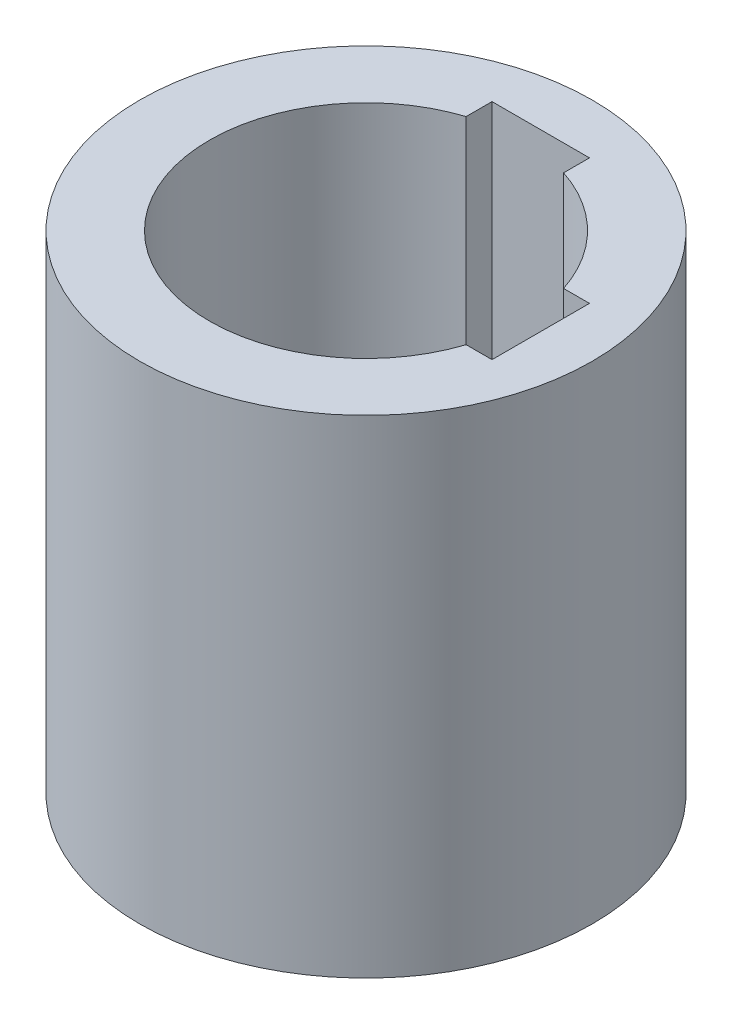
ISO-10303-21;
HEADER;
FILE_DESCRIPTION(('STEP AP214'),'2;1');
FILE_NAME('part.step','',(''),(''),'','','');
FILE_SCHEMA(('AUTOMOTIVE_DESIGN { 1 0 10303 214 1 1 1 1 }'));
ENDSEC;
DATA;
#1=APPLICATION_CONTEXT('core data for automotive mechanical design processes');
#2=APPLICATION_PROTOCOL_DEFINITION('international standard','automotive_design',2000,#1);
#3=PRODUCT_CONTEXT('',#1,'mechanical');
#4=PRODUCT('Part','Part','',(#3));
#5=PRODUCT_RELATED_PRODUCT_CATEGORY('part','',(#4));
#6=PRODUCT_DEFINITION_FORMATION('','',#4);
#7=PRODUCT_DEFINITION_CONTEXT('part definition',#1,'design');
#8=PRODUCT_DEFINITION('design','',#6,#7);
#9=PRODUCT_DEFINITION_SHAPE('','',#8);
#10=(LENGTH_UNIT() NAMED_UNIT(*) SI_UNIT(.MILLI.,.METRE.));
#11=(NAMED_UNIT(*) PLANE_ANGLE_UNIT() SI_UNIT($,.RADIAN.));
#12=(NAMED_UNIT(*) SI_UNIT($,.STERADIAN.) SOLID_ANGLE_UNIT());
#13=UNCERTAINTY_MEASURE_WITH_UNIT(LENGTH_MEASURE(1.E-05),#10,'distance_accuracy_value','');
#14=(GEOMETRIC_REPRESENTATION_CONTEXT(3) GLOBAL_UNCERTAINTY_ASSIGNED_CONTEXT((#13)) GLOBAL_UNIT_ASSIGNED_CONTEXT((#10,
#11,#12)) REPRESENTATION_CONTEXT('',''));
#15=CARTESIAN_POINT('',(0.,0.,0.));
#16=DIRECTION('',(0.,0.,1.));
#17=DIRECTION('',(1.,0.,0.));
#18=AXIS2_PLACEMENT_3D('',#15,#16,#17);
#19=CARTESIAN_POINT('',(0.,35.,0.));
#20=DIRECTION('',(0.,-1.,0.));
#21=DIRECTION('',(0.,0.,-1.));
#22=AXIS2_PLACEMENT_3D('',#19,#20,#21);
#23=CYLINDRICAL_SURFACE('',#22,22.5);
#24=DIRECTION('',(0.,-1.,0.));
#25=VECTOR('',#24,1.);
#26=CARTESIAN_POINT('',(-7.00000000000007,35.,-21.3834047803431));
#27=LINE('',#26,#25);
#28=CARTESIAN_POINT('',(-7.00000000000007,35.,-21.3834047803431));
#29=VERTEX_POINT('',#28);
#30=CARTESIAN_POINT('',(-7.00000000000007,-35.,-21.3834047803431));
#31=VERTEX_POINT('',#30);
#32=EDGE_CURVE('E11',#29,#31,#27,.T.);
#33=ORIENTED_EDGE('',*,*,#32,.F.);
#34=CARTESIAN_POINT('',(0.,35.,0.));
#35=DIRECTION('',(0.,1.,0.));
#36=DIRECTION('',(0.,0.,1.));
#37=AXIS2_PLACEMENT_3D('',#34,#35,#36);
#38=CIRCLE('',#37,22.5);
#39=CARTESIAN_POINT('',(21.3834047803431,35.,7.));
#40=VERTEX_POINT('',#39);
#41=EDGE_CURVE('E151',#29,#40,#38,.T.);
#42=ORIENTED_EDGE('',*,*,#41,.T.);
#43=DIRECTION('',(0.,-1.,0.));
#44=VECTOR('',#43,1.);
#45=CARTESIAN_POINT('',(21.3834047803431,35.,7.));
#46=LINE('',#45,#44);
#47=CARTESIAN_POINT('',(21.3834047803431,-35.,7.));
#48=VERTEX_POINT('',#47);
#49=EDGE_CURVE('E156',#48,#40,#46,.F.);
#50=ORIENTED_EDGE('',*,*,#49,.F.);
#51=CARTESIAN_POINT('',(0.,-35.,0.));
#52=DIRECTION('',(0.,1.,0.));
#53=DIRECTION('',(0.,0.,1.));
#54=AXIS2_PLACEMENT_3D('',#51,#52,#53);
#55=CIRCLE('',#54,22.5);
#56=EDGE_CURVE('E57',#31,#48,#55,.T.);
#57=ORIENTED_EDGE('',*,*,#56,.F.);
#58=EDGE_LOOP('',(#33,#42,#50,#57));
#59=FACE_BOUND('',#58,.T.);
#60=ADVANCED_FACE('F34',(#59),#23,.F.);
#61=CARTESIAN_POINT('',(0.,35.,0.));
#62=DIRECTION('',(0.,1.,0.));
#63=DIRECTION('',(0.,0.,1.));
#64=AXIS2_PLACEMENT_3D('',#61,#62,#63);
#65=PLANE('',#64);
#66=DIRECTION('',(0.,0.,1.));
#67=VECTOR('',#66,1.);
#68=CARTESIAN_POINT('',(-7.00000000000009,35.,-25.1));
#69=LINE('',#68,#67);
#70=CARTESIAN_POINT('',(-7.00000000000009,35.,-25.1));
#71=VERTEX_POINT('',#70);
#72=EDGE_CURVE('E119',#71,#29,#69,.T.);
#73=ORIENTED_EDGE('',*,*,#72,.F.);
#74=DIRECTION('',(-1.,0.,0.));
#75=VECTOR('',#74,1.);
#76=CARTESIAN_POINT('',(6.99999999999991,35.,-25.1));
#77=LINE('',#76,#75);
#78=CARTESIAN_POINT('',(6.99999999999991,35.,-25.1));
#79=VERTEX_POINT('',#78);
#80=EDGE_CURVE('E121',#79,#71,#77,.T.);
#81=ORIENTED_EDGE('',*,*,#80,.F.);
#82=DIRECTION('',(0.,0.,-1.));
#83=VECTOR('',#82,1.);
#84=CARTESIAN_POINT('',(6.99999999999991,35.,-25.1));
#85=LINE('',#84,#83);
#86=CARTESIAN_POINT('',(6.99999999999993,35.,-21.3834047803431));
#87=VERTEX_POINT('',#86);
#88=EDGE_CURVE('E102',#87,#79,#85,.T.);
#89=ORIENTED_EDGE('',*,*,#88,.F.);
#90=CARTESIAN_POINT('',(21.3834047803431,35.,-7.));
#91=VERTEX_POINT('',#90);
#92=EDGE_CURVE('E147',#91,#87,#38,.T.);
#93=ORIENTED_EDGE('',*,*,#92,.F.);
#94=DIRECTION('',(-1.,0.,0.));
#95=VECTOR('',#94,1.);
#96=CARTESIAN_POINT('',(25.1,35.,-7.));
#97=LINE('',#96,#95);
#98=CARTESIAN_POINT('',(25.1,35.,-7.));
#99=VERTEX_POINT('',#98);
#100=EDGE_CURVE('E132',#99,#91,#97,.T.);
#101=ORIENTED_EDGE('',*,*,#100,.F.);
#102=DIRECTION('',(0.,0.,-1.));
#103=VECTOR('',#102,1.);
#104=CARTESIAN_POINT('',(25.1,35.,7.));
#105=LINE('',#104,#103);
#106=CARTESIAN_POINT('',(25.1,35.,7.));
#107=VERTEX_POINT('',#106);
#108=EDGE_CURVE('E139',#107,#99,#105,.T.);
#109=ORIENTED_EDGE('',*,*,#108,.F.);
#110=DIRECTION('',(1.,0.,0.));
#111=VECTOR('',#110,1.);
#112=CARTESIAN_POINT('',(25.1,35.,7.));
#113=LINE('',#112,#111);
#114=EDGE_CURVE('E127',#40,#107,#113,.T.);
#115=ORIENTED_EDGE('',*,*,#114,.F.);
#116=ORIENTED_EDGE('',*,*,#41,.F.);
#117=EDGE_LOOP('',(#73,#81,#89,#93,#101,#109,#115,#116));
#118=FACE_BOUND('',#117,.T.);
#119=CARTESIAN_POINT('',(0.,35.,0.));
#120=DIRECTION('',(0.,1.,0.));
#121=DIRECTION('',(0.,0.,1.));
#122=AXIS2_PLACEMENT_3D('',#119,#120,#121);
#123=CIRCLE('',#122,32.5);
#124=CARTESIAN_POINT('',(0.,35.,32.5));
#125=VERTEX_POINT('',#124);
#126=EDGE_CURVE('E153',#125,#125,#123,.T.);
#127=ORIENTED_EDGE('',*,*,#126,.T.);
#128=EDGE_LOOP('',(#127));
#129=FACE_BOUND('',#128,.T.);
#130=ADVANCED_FACE('F166',(#118,#129),#65,.T.);
#131=CARTESIAN_POINT('',(0.,-35.,0.));
#132=DIRECTION('',(0.,1.,0.));
#133=DIRECTION('',(0.,0.,1.));
#134=AXIS2_PLACEMENT_3D('',#131,#132,#133);
#135=PLANE('',#134);
#136=CARTESIAN_POINT('',(0.,-35.,0.));
#137=DIRECTION('',(0.,1.,0.));
#138=DIRECTION('',(0.,0.,1.));
#139=AXIS2_PLACEMENT_3D('',#136,#137,#138);
#140=CIRCLE('',#139,32.5);
#141=CARTESIAN_POINT('',(0.,-35.,32.5));
#142=VERTEX_POINT('',#141);
#143=EDGE_CURVE('E150',#142,#142,#140,.T.);
#144=ORIENTED_EDGE('',*,*,#143,.F.);
#145=EDGE_LOOP('',(#144));
#146=FACE_BOUND('',#145,.T.);
#147=DIRECTION('',(-1.,0.,0.));
#148=VECTOR('',#147,1.);
#149=CARTESIAN_POINT('',(6.99999999999991,-35.,-25.1));
#150=LINE('',#149,#148);
#151=CARTESIAN_POINT('',(6.99999999999991,-35.,-25.1));
#152=VERTEX_POINT('',#151);
#153=CARTESIAN_POINT('',(-7.00000000000009,-35.,-25.1));
#154=VERTEX_POINT('',#153);
#155=EDGE_CURVE('E110',#152,#154,#150,.T.);
#156=ORIENTED_EDGE('',*,*,#155,.T.);
#157=DIRECTION('',(0.,0.,1.));
#158=VECTOR('',#157,1.);
#159=CARTESIAN_POINT('',(-7.00000000000009,-35.,-25.1));
#160=LINE('',#159,#158);
#161=EDGE_CURVE('E107',#154,#31,#160,.T.);
#162=ORIENTED_EDGE('',*,*,#161,.T.);
#163=ORIENTED_EDGE('',*,*,#56,.T.);
#164=DIRECTION('',(1.,0.,0.));
#165=VECTOR('',#164,1.);
#166=CARTESIAN_POINT('',(25.1,-35.,7.));
#167=LINE('',#166,#165);
#168=CARTESIAN_POINT('',(25.1,-35.,7.));
#169=VERTEX_POINT('',#168);
#170=EDGE_CURVE('E129',#48,#169,#167,.T.);
#171=ORIENTED_EDGE('',*,*,#170,.T.);
#172=DIRECTION('',(0.,0.,-1.));
#173=VECTOR('',#172,1.);
#174=CARTESIAN_POINT('',(25.1,-35.,7.));
#175=LINE('',#174,#173);
#176=CARTESIAN_POINT('',(25.1,-35.,-7.));
#177=VERTEX_POINT('',#176);
#178=EDGE_CURVE('E131',#169,#177,#175,.T.);
#179=ORIENTED_EDGE('',*,*,#178,.T.);
#180=DIRECTION('',(-1.,0.,0.));
#181=VECTOR('',#180,1.);
#182=CARTESIAN_POINT('',(25.1,-35.,-7.));
#183=LINE('',#182,#181);
#184=CARTESIAN_POINT('',(21.3834047803431,-35.,-7.));
#185=VERTEX_POINT('',#184);
#186=EDGE_CURVE('E135',#177,#185,#183,.T.);
#187=ORIENTED_EDGE('',*,*,#186,.T.);
#188=CARTESIAN_POINT('',(6.99999999999993,-35.,-21.3834047803431));
#189=VERTEX_POINT('',#188);
#190=EDGE_CURVE('E118',#185,#189,#55,.T.);
#191=ORIENTED_EDGE('',*,*,#190,.T.);
#192=DIRECTION('',(0.,0.,-1.));
#193=VECTOR('',#192,1.);
#194=CARTESIAN_POINT('',(6.99999999999991,-35.,-25.1));
#195=LINE('',#194,#193);
#196=EDGE_CURVE('E49',#189,#152,#195,.T.);
#197=ORIENTED_EDGE('',*,*,#196,.T.);
#198=EDGE_LOOP('',(#156,#162,#163,#171,#179,#187,#191,#197));
#199=FACE_BOUND('',#198,.T.);
#200=ADVANCED_FACE('F115',(#146,#199),#135,.F.);
#201=CARTESIAN_POINT('',(0.,35.,0.));
#202=DIRECTION('',(0.,-1.,0.));
#203=DIRECTION('',(0.,0.,-1.));
#204=AXIS2_PLACEMENT_3D('',#201,#202,#203);
#205=CYLINDRICAL_SURFACE('',#204,32.5);
#206=ORIENTED_EDGE('',*,*,#126,.F.);
#207=EDGE_LOOP('',(#206));
#208=FACE_BOUND('',#207,.T.);
#209=ORIENTED_EDGE('',*,*,#143,.T.);
#210=EDGE_LOOP('',(#209));
#211=FACE_BOUND('',#210,.T.);
#212=ADVANCED_FACE('F36',(#208,#211),#205,.T.);
#213=DIRECTION('',(0.,-1.,0.));
#214=VECTOR('',#213,1.);
#215=CARTESIAN_POINT('',(6.99999999999993,35.,-21.3834047803431));
#216=LINE('',#215,#214);
#217=EDGE_CURVE('E42',#189,#87,#216,.F.);
#218=ORIENTED_EDGE('',*,*,#217,.F.);
#219=ORIENTED_EDGE('',*,*,#190,.F.);
#220=DIRECTION('',(0.,-1.,0.));
#221=VECTOR('',#220,1.);
#222=CARTESIAN_POINT('',(21.3834047803431,35.,-7.));
#223=LINE('',#222,#221);
#224=EDGE_CURVE('E161',#91,#185,#223,.T.);
#225=ORIENTED_EDGE('',*,*,#224,.F.);
#226=ORIENTED_EDGE('',*,*,#92,.T.);
#227=EDGE_LOOP('',(#218,#219,#225,#226));
#228=FACE_BOUND('',#227,.T.);
#229=ADVANCED_FACE('F170',(#228),#23,.F.);
#230=CARTESIAN_POINT('',(25.1,-35.,-7.));
#231=DIRECTION('',(0.,0.,-1.));
#232=DIRECTION('',(-1.,0.,0.));
#233=AXIS2_PLACEMENT_3D('',#230,#231,#232);
#234=PLANE('',#233);
#235=ORIENTED_EDGE('',*,*,#224,.T.);
#236=ORIENTED_EDGE('',*,*,#186,.F.);
#237=DIRECTION('',(0.,1.,0.));
#238=VECTOR('',#237,1.);
#239=CARTESIAN_POINT('',(25.1,-35.,-7.));
#240=LINE('',#239,#238);
#241=EDGE_CURVE('E143',#177,#99,#240,.T.);
#242=ORIENTED_EDGE('',*,*,#241,.T.);
#243=ORIENTED_EDGE('',*,*,#100,.T.);
#244=EDGE_LOOP('',(#235,#236,#242,#243));
#245=FACE_BOUND('',#244,.T.);
#246=ADVANCED_FACE('F173',(#245),#234,.F.);
#247=CARTESIAN_POINT('',(25.1,-35.,7.));
#248=DIRECTION('',(1.,0.,0.));
#249=DIRECTION('',(0.,0.,-1.));
#250=AXIS2_PLACEMENT_3D('',#247,#248,#249);
#251=PLANE('',#250);
#252=ORIENTED_EDGE('',*,*,#108,.T.);
#253=ORIENTED_EDGE('',*,*,#241,.F.);
#254=ORIENTED_EDGE('',*,*,#178,.F.);
#255=DIRECTION('',(0.,1.,0.));
#256=VECTOR('',#255,1.);
#257=CARTESIAN_POINT('',(25.1,-35.,7.));
#258=LINE('',#257,#256);
#259=EDGE_CURVE('E137',#169,#107,#258,.T.);
#260=ORIENTED_EDGE('',*,*,#259,.T.);
#261=EDGE_LOOP('',(#252,#253,#254,#260));
#262=FACE_BOUND('',#261,.T.);
#263=ADVANCED_FACE('F176',(#262),#251,.F.);
#264=CARTESIAN_POINT('',(25.1,-35.,7.));
#265=DIRECTION('',(0.,0.,1.));
#266=DIRECTION('',(1.,0.,0.));
#267=AXIS2_PLACEMENT_3D('',#264,#265,#266);
#268=PLANE('',#267);
#269=ORIENTED_EDGE('',*,*,#49,.T.);
#270=ORIENTED_EDGE('',*,*,#114,.T.);
#271=ORIENTED_EDGE('',*,*,#259,.F.);
#272=ORIENTED_EDGE('',*,*,#170,.F.);
#273=EDGE_LOOP('',(#269,#270,#271,#272));
#274=FACE_BOUND('',#273,.T.);
#275=ADVANCED_FACE('F181',(#274),#268,.F.);
#276=CARTESIAN_POINT('',(-7.00000000000009,-35.,-25.1));
#277=DIRECTION('',(-1.,0.,0.));
#278=DIRECTION('',(0.,0.,1.));
#279=AXIS2_PLACEMENT_3D('',#276,#277,#278);
#280=PLANE('',#279);
#281=ORIENTED_EDGE('',*,*,#32,.T.);
#282=ORIENTED_EDGE('',*,*,#161,.F.);
#283=DIRECTION('',(0.,1.,0.));
#284=VECTOR('',#283,1.);
#285=CARTESIAN_POINT('',(-7.00000000000009,-35.,-25.1));
#286=LINE('',#285,#284);
#287=EDGE_CURVE('E106',#154,#71,#286,.T.);
#288=ORIENTED_EDGE('',*,*,#287,.T.);
#289=ORIENTED_EDGE('',*,*,#72,.T.);
#290=EDGE_LOOP('',(#281,#282,#288,#289));
#291=FACE_BOUND('',#290,.T.);
#292=ADVANCED_FACE('F186',(#291),#280,.F.);
#293=CARTESIAN_POINT('',(6.99999999999991,-35.,-25.1));
#294=DIRECTION('',(0.,0.,-1.));
#295=DIRECTION('',(-1.,0.,0.));
#296=AXIS2_PLACEMENT_3D('',#293,#294,#295);
#297=PLANE('',#296);
#298=ORIENTED_EDGE('',*,*,#80,.T.);
#299=ORIENTED_EDGE('',*,*,#287,.F.);
#300=ORIENTED_EDGE('',*,*,#155,.F.);
#301=DIRECTION('',(0.,1.,0.));
#302=VECTOR('',#301,1.);
#303=CARTESIAN_POINT('',(6.99999999999991,-35.,-25.1));
#304=LINE('',#303,#302);
#305=EDGE_CURVE('E98',#152,#79,#304,.T.);
#306=ORIENTED_EDGE('',*,*,#305,.T.);
#307=EDGE_LOOP('',(#298,#299,#300,#306));
#308=FACE_BOUND('',#307,.T.);
#309=ADVANCED_FACE('F111',(#308),#297,.F.);
#310=CARTESIAN_POINT('',(6.99999999999991,-35.,-25.1));
#311=DIRECTION('',(1.,0.,0.));
#312=DIRECTION('',(0.,0.,-1.));
#313=AXIS2_PLACEMENT_3D('',#310,#311,#312);
#314=PLANE('',#313);
#315=ORIENTED_EDGE('',*,*,#217,.T.);
#316=ORIENTED_EDGE('',*,*,#88,.T.);
#317=ORIENTED_EDGE('',*,*,#305,.F.);
#318=ORIENTED_EDGE('',*,*,#196,.F.);
#319=EDGE_LOOP('',(#315,#316,#317,#318));
#320=FACE_BOUND('',#319,.T.);
#321=ADVANCED_FACE('F100',(#320),#314,.F.);
#322=CLOSED_SHELL('',(#60,#130,#200,#212,#229,#246,#263,#275,#292,#309,#321));
#323=MANIFOLD_SOLID_BREP('B2',#322);
#324=ADVANCED_BREP_SHAPE_REPRESENTATION('',(#18,#323),#14);
#325=SHAPE_DEFINITION_REPRESENTATION(#9,#324);
ENDSEC;
END-ISO-10303-21;
